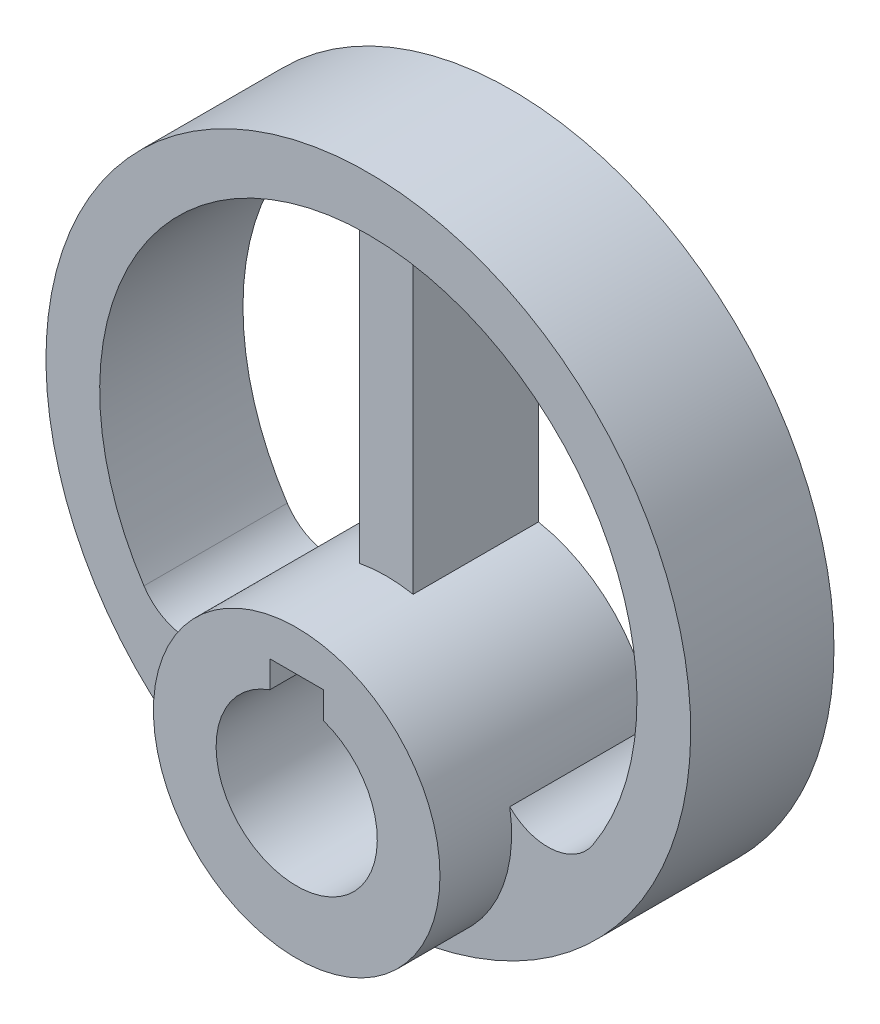
ISO-10303-21;
HEADER;
FILE_DESCRIPTION(('STEP AP214'),'2;1');
FILE_NAME('part.step','',(''),(''),'','','');
FILE_SCHEMA(('AUTOMOTIVE_DESIGN { 1 0 10303 214 1 1 1 1 }'));
ENDSEC;
DATA;
#1=APPLICATION_CONTEXT('core data for automotive mechanical design processes');
#2=APPLICATION_PROTOCOL_DEFINITION('international standard','automotive_design',2000,#1);
#3=PRODUCT_CONTEXT('',#1,'mechanical');
#4=PRODUCT('Part','Part','',(#3));
#5=PRODUCT_RELATED_PRODUCT_CATEGORY('part','',(#4));
#6=PRODUCT_DEFINITION_FORMATION('','',#4);
#7=PRODUCT_DEFINITION_CONTEXT('part definition',#1,'design');
#8=PRODUCT_DEFINITION('design','',#6,#7);
#9=PRODUCT_DEFINITION_SHAPE('','',#8);
#10=(LENGTH_UNIT() NAMED_UNIT(*) SI_UNIT(.MILLI.,.METRE.));
#11=(NAMED_UNIT(*) PLANE_ANGLE_UNIT() SI_UNIT($,.RADIAN.));
#12=(NAMED_UNIT(*) SI_UNIT($,.STERADIAN.) SOLID_ANGLE_UNIT());
#13=UNCERTAINTY_MEASURE_WITH_UNIT(LENGTH_MEASURE(1.E-05),#10,'distance_accuracy_value','');
#14=(GEOMETRIC_REPRESENTATION_CONTEXT(3) GLOBAL_UNCERTAINTY_ASSIGNED_CONTEXT((#13)) GLOBAL_UNIT_ASSIGNED_CONTEXT((#10,
#11,#12)) REPRESENTATION_CONTEXT('',''));
#15=CARTESIAN_POINT('',(0.,0.,0.));
#16=DIRECTION('',(0.,0.,1.));
#17=DIRECTION('',(1.,0.,0.));
#18=AXIS2_PLACEMENT_3D('',#15,#16,#17);
#19=CARTESIAN_POINT('',(0.,0.,25.4));
#20=DIRECTION('',(0.,0.,-1.));
#21=DIRECTION('',(-1.,0.,0.));
#22=AXIS2_PLACEMENT_3D('',#19,#20,#21);
#23=CYLINDRICAL_SURFACE('',#22,47.625);
#24=CARTESIAN_POINT('',(0.,0.,0.));
#25=DIRECTION('',(0.,0.,1.));
#26=DIRECTION('',(1.,0.,0.));
#27=AXIS2_PLACEMENT_3D('',#24,#25,#26);
#28=CIRCLE('',#27,47.625);
#29=CARTESIAN_POINT('',(-4.7625,47.3862766922028,0.));
#30=VERTEX_POINT('',#29);
#31=CARTESIAN_POINT('',(-39.7790804501483,-26.1871224753815,0.));
#32=VERTEX_POINT('',#31);
#33=EDGE_CURVE('E155',#30,#32,#28,.T.);
#34=ORIENTED_EDGE('',*,*,#33,.F.);
#35=DIRECTION('',(0.,0.,-1.));
#36=VECTOR('',#35,1.);
#37=CARTESIAN_POINT('',(-4.7625,47.3862766922028,25.4));
#38=LINE('',#37,#36);
#39=CARTESIAN_POINT('',(-4.7625,47.3862766922028,22.225));
#40=VERTEX_POINT('',#39);
#41=EDGE_CURVE('E232',#30,#40,#38,.F.);
#42=ORIENTED_EDGE('',*,*,#41,.T.);
#43=CARTESIAN_POINT('',(0.,0.,22.225));
#44=DIRECTION('',(0.,0.,-1.));
#45=DIRECTION('',(-1.,0.,0.));
#46=AXIS2_PLACEMENT_3D('',#43,#44,#45);
#47=CIRCLE('',#46,47.625);
#48=CARTESIAN_POINT('',(4.7625,47.3862766922028,22.225));
#49=VERTEX_POINT('',#48);
#50=EDGE_CURVE('E148',#40,#49,#47,.T.);
#51=ORIENTED_EDGE('',*,*,#50,.T.);
#52=DIRECTION('',(0.,0.,-1.));
#53=VECTOR('',#52,1.);
#54=CARTESIAN_POINT('',(4.7625,47.3862766922028,25.4));
#55=LINE('',#54,#53);
#56=CARTESIAN_POINT('',(4.7625,47.3862766922028,0.));
#57=VERTEX_POINT('',#56);
#58=EDGE_CURVE('E133',#49,#57,#55,.T.);
#59=ORIENTED_EDGE('',*,*,#58,.T.);
#60=CARTESIAN_POINT('',(39.7790804501483,-26.1871224753815,0.));
#61=VERTEX_POINT('',#60);
#62=EDGE_CURVE('E145',#61,#57,#28,.T.);
#63=ORIENTED_EDGE('',*,*,#62,.F.);
#64=DIRECTION('',(0.,0.,-1.));
#65=VECTOR('',#64,1.);
#66=CARTESIAN_POINT('',(39.7790804501483,-26.1871224753815,25.4));
#67=LINE('',#66,#65);
#68=CARTESIAN_POINT('',(39.7790804501483,-26.1871224753815,25.4));
#69=VERTEX_POINT('',#68);
#70=EDGE_CURVE('E188',#69,#61,#67,.T.);
#71=ORIENTED_EDGE('',*,*,#70,.F.);
#72=CARTESIAN_POINT('',(0.,0.,25.4));
#73=DIRECTION('',(0.,0.,1.));
#74=DIRECTION('',(1.,0.,0.));
#75=AXIS2_PLACEMENT_3D('',#72,#73,#74);
#76=CIRCLE('',#75,47.625);
#77=CARTESIAN_POINT('',(-39.7790804501483,-26.1871224753815,25.4));
#78=VERTEX_POINT('',#77);
#79=EDGE_CURVE('E184',#69,#78,#76,.T.);
#80=ORIENTED_EDGE('',*,*,#79,.T.);
#81=DIRECTION('',(0.,0.,-1.));
#82=VECTOR('',#81,1.);
#83=CARTESIAN_POINT('',(-39.7790804501483,-26.1871224753815,25.4));
#84=LINE('',#83,#82);
#85=EDGE_CURVE('E196',#78,#32,#84,.T.);
#86=ORIENTED_EDGE('',*,*,#85,.T.);
#87=EDGE_LOOP('',(#34,#42,#51,#59,#63,#71,#80,#86));
#88=FACE_BOUND('',#87,.T.);
#89=ADVANCED_FACE('F42',(#88),#23,.F.);
#90=CARTESIAN_POINT('',(0.,-31.75,25.4));
#91=DIRECTION('',(0.,0.,-1.));
#92=DIRECTION('',(-1.,0.,0.));
#93=AXIS2_PLACEMENT_3D('',#90,#91,#92);
#94=CYLINDRICAL_SURFACE('',#93,25.4);
#95=CARTESIAN_POINT('',(0.,-31.75,38.1));
#96=DIRECTION('',(0.,0.,1.));
#97=DIRECTION('',(1.,0.,0.));
#98=AXIS2_PLACEMENT_3D('',#95,#96,#97);
#99=CIRCLE('',#98,25.4);
#100=CARTESIAN_POINT('',(25.4,-31.75,38.1));
#101=VERTEX_POINT('',#100);
#102=EDGE_CURVE('E159',#101,#101,#99,.T.);
#103=ORIENTED_EDGE('',*,*,#102,.F.);
#104=EDGE_LOOP('',(#103));
#105=FACE_BOUND('',#104,.T.);
#106=DIRECTION('',(0.,0.,-1.));
#107=VECTOR('',#106,1.);
#108=CARTESIAN_POINT('',(-4.7625,-6.80047908776604,25.4));
#109=LINE('',#108,#107);
#110=CARTESIAN_POINT('',(-4.7625,-6.80047908776604,0.));
#111=VERTEX_POINT('',#110);
#112=CARTESIAN_POINT('',(-4.7625,-6.80047908776604,22.225));
#113=VERTEX_POINT('',#112);
#114=EDGE_CURVE('E149',#111,#113,#109,.F.);
#115=ORIENTED_EDGE('',*,*,#114,.F.);
#116=CARTESIAN_POINT('',(0.,-31.75,0.));
#117=DIRECTION('',(0.,0.,1.));
#118=DIRECTION('',(1.,0.,0.));
#119=AXIS2_PLACEMENT_3D('',#116,#117,#118);
#120=CIRCLE('',#119,25.4);
#121=CARTESIAN_POINT('',(-25.0695784709871,-27.6663453516465,0.));
#122=VERTEX_POINT('',#121);
#123=EDGE_CURVE('E157',#111,#122,#120,.T.);
#124=ORIENTED_EDGE('',*,*,#123,.T.);
#125=DIRECTION('',(0.,0.,-1.));
#126=VECTOR('',#125,1.);
#127=CARTESIAN_POINT('',(-25.0695784709871,-27.6663453516465,25.4));
#128=LINE('',#127,#126);
#129=CARTESIAN_POINT('',(-25.0695784709871,-27.6663453516465,25.4));
#130=VERTEX_POINT('',#129);
#131=EDGE_CURVE('E199',#130,#122,#128,.T.);
#132=ORIENTED_EDGE('',*,*,#131,.F.);
#133=CARTESIAN_POINT('',(0.,-31.75,25.4));
#134=DIRECTION('',(0.,0.,1.));
#135=DIRECTION('',(1.,0.,0.));
#136=AXIS2_PLACEMENT_3D('',#133,#134,#135);
#137=CIRCLE('',#136,25.4);
#138=CARTESIAN_POINT('',(0.,-57.15,25.4));
#139=VERTEX_POINT('',#138);
#140=EDGE_CURVE('E49',#130,#139,#137,.T.);
#141=ORIENTED_EDGE('',*,*,#140,.T.);
#142=CARTESIAN_POINT('',(25.0695784709871,-27.6663453516465,25.4));
#143=VERTEX_POINT('',#142);
#144=EDGE_CURVE('E195',#139,#143,#137,.T.);
#145=ORIENTED_EDGE('',*,*,#144,.T.);
#146=DIRECTION('',(0.,0.,-1.));
#147=VECTOR('',#146,1.);
#148=CARTESIAN_POINT('',(25.0695784709871,-27.6663453516465,25.4));
#149=LINE('',#148,#147);
#150=CARTESIAN_POINT('',(25.0695784709871,-27.6663453516465,0.));
#151=VERTEX_POINT('',#150);
#152=EDGE_CURVE('E202',#143,#151,#149,.T.);
#153=ORIENTED_EDGE('',*,*,#152,.T.);
#154=CARTESIAN_POINT('',(4.7625,-6.80047908776603,0.));
#155=VERTEX_POINT('',#154);
#156=EDGE_CURVE('E164',#151,#155,#120,.T.);
#157=ORIENTED_EDGE('',*,*,#156,.T.);
#158=DIRECTION('',(0.,0.,-1.));
#159=VECTOR('',#158,1.);
#160=CARTESIAN_POINT('',(4.7625,-6.80047908776603,25.4));
#161=LINE('',#160,#159);
#162=CARTESIAN_POINT('',(4.7625,-6.80047908776604,22.225));
#163=VERTEX_POINT('',#162);
#164=EDGE_CURVE('E56',#163,#155,#161,.T.);
#165=ORIENTED_EDGE('',*,*,#164,.F.);
#166=CARTESIAN_POINT('',(0.,-31.75,22.225));
#167=DIRECTION('',(0.,0.,-1.));
#168=DIRECTION('',(-1.,0.,0.));
#169=AXIS2_PLACEMENT_3D('',#166,#167,#168);
#170=CIRCLE('',#169,25.4);
#171=EDGE_CURVE('E11',#113,#163,#170,.T.);
#172=ORIENTED_EDGE('',*,*,#171,.F.);
#173=EDGE_LOOP('',(#115,#124,#132,#141,#145,#153,#157,#165,#172));
#174=FACE_BOUND('',#173,.T.);
#175=ADVANCED_FACE('F227',(#105,#174),#94,.T.);
#176=CARTESIAN_POINT('',(0.,-31.75,25.4));
#177=DIRECTION('',(0.,0.,-1.));
#178=DIRECTION('',(-1.,0.,0.));
#179=AXIS2_PLACEMENT_3D('',#176,#177,#178);
#180=CYLINDRICAL_SURFACE('',#179,14.2875);
#181=CARTESIAN_POINT('',(0.,-31.75,0.));
#182=DIRECTION('',(0.,0.,1.));
#183=DIRECTION('',(1.,0.,0.));
#184=AXIS2_PLACEMENT_3D('',#181,#182,#183);
#185=CIRCLE('',#184,14.2875);
#186=CARTESIAN_POINT('',(-4.7625,-18.2796158183963,0.));
#187=VERTEX_POINT('',#186);
#188=CARTESIAN_POINT('',(4.7625,-18.2796158183963,0.));
#189=VERTEX_POINT('',#188);
#190=EDGE_CURVE('E169',#187,#189,#185,.T.);
#191=ORIENTED_EDGE('',*,*,#190,.F.);
#192=DIRECTION('',(0.,0.,-1.));
#193=VECTOR('',#192,1.);
#194=CARTESIAN_POINT('',(-4.7625,-18.2796158183963,25.4));
#195=LINE('',#194,#193);
#196=CARTESIAN_POINT('',(-4.7625,-18.2796158183963,38.1));
#197=VERTEX_POINT('',#196);
#198=EDGE_CURVE('E193',#197,#187,#195,.T.);
#199=ORIENTED_EDGE('',*,*,#198,.F.);
#200=CARTESIAN_POINT('',(0.,-31.75,38.1));
#201=DIRECTION('',(0.,0.,1.));
#202=DIRECTION('',(1.,0.,0.));
#203=AXIS2_PLACEMENT_3D('',#200,#201,#202);
#204=CIRCLE('',#203,14.2875);
#205=CARTESIAN_POINT('',(4.7625,-18.2796158183963,38.1));
#206=VERTEX_POINT('',#205);
#207=EDGE_CURVE('E241',#197,#206,#204,.T.);
#208=ORIENTED_EDGE('',*,*,#207,.T.);
#209=DIRECTION('',(0.,0.,-1.));
#210=VECTOR('',#209,1.);
#211=CARTESIAN_POINT('',(4.7625,-18.2796158183963,25.4));
#212=LINE('',#211,#210);
#213=EDGE_CURVE('E185',#206,#189,#212,.T.);
#214=ORIENTED_EDGE('',*,*,#213,.T.);
#215=EDGE_LOOP('',(#191,#199,#208,#214));
#216=FACE_BOUND('',#215,.T.);
#217=ADVANCED_FACE('F262',(#216),#180,.F.);
#218=CARTESIAN_POINT('',(-4.7625,0.,25.4));
#219=DIRECTION('',(1.,0.,0.));
#220=DIRECTION('',(0.,1.,0.));
#221=AXIS2_PLACEMENT_3D('',#218,#219,#220);
#222=PLANE('',#221);
#223=DIRECTION('',(0.,-1.,0.));
#224=VECTOR('',#223,1.);
#225=CARTESIAN_POINT('',(-4.7625,0.,0.));
#226=LINE('',#225,#224);
#227=CARTESIAN_POINT('',(-4.7625,-13.5171158183963,0.));
#228=VERTEX_POINT('',#227);
#229=EDGE_CURVE('E172',#228,#187,#226,.T.);
#230=ORIENTED_EDGE('',*,*,#229,.F.);
#231=DIRECTION('',(0.,0.,-1.));
#232=VECTOR('',#231,1.);
#233=CARTESIAN_POINT('',(-4.7625,-13.5171158183963,25.4));
#234=LINE('',#233,#232);
#235=CARTESIAN_POINT('',(-4.7625,-13.5171158183963,38.1));
#236=VERTEX_POINT('',#235);
#237=EDGE_CURVE('E191',#236,#228,#234,.T.);
#238=ORIENTED_EDGE('',*,*,#237,.F.);
#239=DIRECTION('',(0.,-1.,0.));
#240=VECTOR('',#239,1.);
#241=CARTESIAN_POINT('',(-4.7625,-18.2796158183963,38.1));
#242=LINE('',#241,#240);
#243=EDGE_CURVE('E253',#236,#197,#242,.T.);
#244=ORIENTED_EDGE('',*,*,#243,.T.);
#245=ORIENTED_EDGE('',*,*,#198,.T.);
#246=EDGE_LOOP('',(#230,#238,#244,#245));
#247=FACE_BOUND('',#246,.T.);
#248=ADVANCED_FACE('F268',(#247),#222,.T.);
#249=CARTESIAN_POINT('',(0.,-13.5171158183963,25.4));
#250=DIRECTION('',(0.,1.,0.));
#251=DIRECTION('',(0.,0.,1.));
#252=AXIS2_PLACEMENT_3D('',#249,#250,#251);
#253=PLANE('',#252);
#254=DIRECTION('',(1.,0.,0.));
#255=VECTOR('',#254,1.);
#256=CARTESIAN_POINT('',(0.,-13.5171158183963,0.));
#257=LINE('',#256,#255);
#258=CARTESIAN_POINT('',(4.7625,-13.5171158183963,0.));
#259=VERTEX_POINT('',#258);
#260=EDGE_CURVE('E175',#228,#259,#257,.T.);
#261=ORIENTED_EDGE('',*,*,#260,.T.);
#262=DIRECTION('',(0.,0.,-1.));
#263=VECTOR('',#262,1.);
#264=CARTESIAN_POINT('',(4.7625,-13.5171158183963,25.4));
#265=LINE('',#264,#263);
#266=CARTESIAN_POINT('',(4.7625,-13.5171158183963,38.1));
#267=VERTEX_POINT('',#266);
#268=EDGE_CURVE('E187',#267,#259,#265,.T.);
#269=ORIENTED_EDGE('',*,*,#268,.F.);
#270=DIRECTION('',(-1.,0.,0.));
#271=VECTOR('',#270,1.);
#272=CARTESIAN_POINT('',(-4.7625,-13.5171158183963,38.1));
#273=LINE('',#272,#271);
#274=EDGE_CURVE('E250',#267,#236,#273,.T.);
#275=ORIENTED_EDGE('',*,*,#274,.T.);
#276=ORIENTED_EDGE('',*,*,#237,.T.);
#277=EDGE_LOOP('',(#261,#269,#275,#276));
#278=FACE_BOUND('',#277,.T.);
#279=ADVANCED_FACE('F274',(#278),#253,.F.);
#280=CARTESIAN_POINT('',(31.8232643601186,-20.9496979803052,25.4));
#281=DIRECTION('',(0.,0.,-1.));
#282=DIRECTION('',(-1.,0.,0.));
#283=AXIS2_PLACEMENT_3D('',#280,#281,#282);
#284=CYLINDRICAL_SURFACE('',#283,9.525);
#285=CARTESIAN_POINT('',(31.8232643601186,-20.9496979803052,0.));
#286=DIRECTION('',(0.,0.,1.));
#287=DIRECTION('',(1.,0.,0.));
#288=AXIS2_PLACEMENT_3D('',#285,#286,#287);
#289=CIRCLE('',#288,9.525);
#290=EDGE_CURVE('E154',#151,#61,#289,.T.);
#291=ORIENTED_EDGE('',*,*,#290,.F.);
#292=ORIENTED_EDGE('',*,*,#152,.F.);
#293=CARTESIAN_POINT('',(31.8232643601186,-20.9496979803052,25.4));
#294=DIRECTION('',(0.,0.,1.));
#295=DIRECTION('',(1.,0.,0.));
#296=AXIS2_PLACEMENT_3D('',#293,#294,#295);
#297=CIRCLE('',#296,9.525);
#298=EDGE_CURVE('E207',#143,#69,#297,.T.);
#299=ORIENTED_EDGE('',*,*,#298,.T.);
#300=ORIENTED_EDGE('',*,*,#70,.T.);
#301=EDGE_LOOP('',(#291,#292,#299,#300));
#302=FACE_BOUND('',#301,.T.);
#303=ADVANCED_FACE('F205',(#302),#284,.F.);
#304=CARTESIAN_POINT('',(4.7625,0.,25.4));
#305=DIRECTION('',(1.,0.,0.));
#306=DIRECTION('',(0.,0.,-1.));
#307=AXIS2_PLACEMENT_3D('',#304,#305,#306);
#308=PLANE('',#307);
#309=DIRECTION('',(0.,-1.,0.));
#310=VECTOR('',#309,1.);
#311=CARTESIAN_POINT('',(4.7625,0.,0.));
#312=LINE('',#311,#310);
#313=EDGE_CURVE('E178',#259,#189,#312,.T.);
#314=ORIENTED_EDGE('',*,*,#313,.T.);
#315=ORIENTED_EDGE('',*,*,#213,.F.);
#316=DIRECTION('',(0.,1.,0.));
#317=VECTOR('',#316,1.);
#318=CARTESIAN_POINT('',(4.7625,-13.5171158183963,38.1));
#319=LINE('',#318,#317);
#320=EDGE_CURVE('E247',#206,#267,#319,.T.);
#321=ORIENTED_EDGE('',*,*,#320,.T.);
#322=ORIENTED_EDGE('',*,*,#268,.T.);
#323=EDGE_LOOP('',(#314,#315,#321,#322));
#324=FACE_BOUND('',#323,.T.);
#325=ADVANCED_FACE('F273',(#324),#308,.F.);
#326=CARTESIAN_POINT('',(-31.8232643601186,-20.9496979803052,25.4));
#327=DIRECTION('',(0.,0.,-1.));
#328=DIRECTION('',(-1.,0.,0.));
#329=AXIS2_PLACEMENT_3D('',#326,#327,#328);
#330=CYLINDRICAL_SURFACE('',#329,9.525);
#331=CARTESIAN_POINT('',(-31.8232643601186,-20.9496979803052,0.));
#332=DIRECTION('',(0.,0.,1.));
#333=DIRECTION('',(1.,0.,0.));
#334=AXIS2_PLACEMENT_3D('',#331,#332,#333);
#335=CIRCLE('',#334,9.525);
#336=EDGE_CURVE('E166',#122,#32,#335,.F.);
#337=ORIENTED_EDGE('',*,*,#336,.T.);
#338=ORIENTED_EDGE('',*,*,#85,.F.);
#339=CARTESIAN_POINT('',(-31.8232643601186,-20.9496979803052,25.4));
#340=DIRECTION('',(0.,0.,1.));
#341=DIRECTION('',(1.,0.,0.));
#342=AXIS2_PLACEMENT_3D('',#339,#340,#341);
#343=CIRCLE('',#342,9.525);
#344=EDGE_CURVE('E213',#130,#78,#343,.F.);
#345=ORIENTED_EDGE('',*,*,#344,.F.);
#346=ORIENTED_EDGE('',*,*,#131,.T.);
#347=EDGE_LOOP('',(#337,#338,#345,#346));
#348=FACE_BOUND('',#347,.T.);
#349=ADVANCED_FACE('F230',(#348),#330,.F.);
#350=CARTESIAN_POINT('',(0.,0.,25.4));
#351=DIRECTION('',(0.,0.,-1.));
#352=DIRECTION('',(-1.,0.,0.));
#353=AXIS2_PLACEMENT_3D('',#350,#351,#352);
#354=CYLINDRICAL_SURFACE('',#353,57.15);
#355=CARTESIAN_POINT('',(0.,0.,25.4));
#356=DIRECTION('',(0.,0.,1.));
#357=DIRECTION('',(1.,0.,0.));
#358=AXIS2_PLACEMENT_3D('',#355,#356,#357);
#359=CIRCLE('',#358,57.15);
#360=EDGE_CURVE('E161',#139,#139,#359,.T.);
#361=ORIENTED_EDGE('',*,*,#360,.F.);
#362=EDGE_LOOP('',(#361));
#363=FACE_BOUND('',#362,.T.);
#364=CARTESIAN_POINT('',(0.,0.,0.));
#365=DIRECTION('',(0.,0.,1.));
#366=DIRECTION('',(1.,0.,0.));
#367=AXIS2_PLACEMENT_3D('',#364,#365,#366);
#368=CIRCLE('',#367,57.15);
#369=CARTESIAN_POINT('',(57.15,0.,0.));
#370=VERTEX_POINT('',#369);
#371=EDGE_CURVE('E181',#370,#370,#368,.T.);
#372=ORIENTED_EDGE('',*,*,#371,.T.);
#373=EDGE_LOOP('',(#372));
#374=FACE_BOUND('',#373,.T.);
#375=ADVANCED_FACE('F225',(#363,#374),#354,.T.);
#376=CARTESIAN_POINT('',(0.,0.,25.4));
#377=DIRECTION('',(0.,0.,1.));
#378=DIRECTION('',(1.,0.,0.));
#379=AXIS2_PLACEMENT_3D('',#376,#377,#378);
#380=PLANE('',#379);
#381=ORIENTED_EDGE('',*,*,#140,.F.);
#382=ORIENTED_EDGE('',*,*,#344,.T.);
#383=ORIENTED_EDGE('',*,*,#79,.F.);
#384=ORIENTED_EDGE('',*,*,#298,.F.);
#385=ORIENTED_EDGE('',*,*,#144,.F.);
#386=ORIENTED_EDGE('',*,*,#360,.T.);
#387=EDGE_LOOP('',(#381,#382,#383,#384,#385,#386));
#388=FACE_BOUND('',#387,.T.);
#389=ADVANCED_FACE('F211',(#388),#380,.T.);
#390=CARTESIAN_POINT('',(0.,0.,0.));
#391=DIRECTION('',(0.,0.,1.));
#392=DIRECTION('',(1.,0.,0.));
#393=AXIS2_PLACEMENT_3D('',#390,#391,#392);
#394=PLANE('',#393);
#395=DIRECTION('',(0.,-1.,0.));
#396=VECTOR('',#395,1.);
#397=CARTESIAN_POINT('',(-4.7625,-7.67136315049299,0.));
#398=LINE('',#397,#396);
#399=EDGE_CURVE('E139',#30,#111,#398,.T.);
#400=ORIENTED_EDGE('',*,*,#399,.F.);
#401=ORIENTED_EDGE('',*,*,#33,.T.);
#402=ORIENTED_EDGE('',*,*,#336,.F.);
#403=ORIENTED_EDGE('',*,*,#123,.F.);
#404=EDGE_LOOP('',(#400,#401,#402,#403));
#405=FACE_BOUND('',#404,.T.);
#406=ORIENTED_EDGE('',*,*,#62,.T.);
#407=DIRECTION('',(0.,1.,0.));
#408=VECTOR('',#407,1.);
#409=CARTESIAN_POINT('',(4.7625,-7.67136315049299,0.));
#410=LINE('',#409,#408);
#411=EDGE_CURVE('E129',#155,#57,#410,.T.);
#412=ORIENTED_EDGE('',*,*,#411,.F.);
#413=ORIENTED_EDGE('',*,*,#156,.F.);
#414=ORIENTED_EDGE('',*,*,#290,.T.);
#415=EDGE_LOOP('',(#406,#412,#413,#414));
#416=FACE_BOUND('',#415,.T.);
#417=ORIENTED_EDGE('',*,*,#190,.T.);
#418=ORIENTED_EDGE('',*,*,#313,.F.);
#419=ORIENTED_EDGE('',*,*,#260,.F.);
#420=ORIENTED_EDGE('',*,*,#229,.T.);
#421=EDGE_LOOP('',(#417,#418,#419,#420));
#422=FACE_BOUND('',#421,.T.);
#423=ORIENTED_EDGE('',*,*,#371,.F.);
#424=EDGE_LOOP('',(#423));
#425=FACE_BOUND('',#424,.T.);
#426=ADVANCED_FACE('F151',(#405,#416,#422,#425),#394,.F.);
#427=CARTESIAN_POINT('',(0.,-31.75,38.1));
#428=DIRECTION('',(0.,0.,1.));
#429=DIRECTION('',(1.,0.,0.));
#430=AXIS2_PLACEMENT_3D('',#427,#428,#429);
#431=PLANE('',#430);
#432=ORIENTED_EDGE('',*,*,#102,.T.);
#433=EDGE_LOOP('',(#432));
#434=FACE_BOUND('',#433,.T.);
#435=ORIENTED_EDGE('',*,*,#320,.F.);
#436=ORIENTED_EDGE('',*,*,#207,.F.);
#437=ORIENTED_EDGE('',*,*,#243,.F.);
#438=ORIENTED_EDGE('',*,*,#274,.F.);
#439=EDGE_LOOP('',(#435,#436,#437,#438));
#440=FACE_BOUND('',#439,.T.);
#441=ADVANCED_FACE('F258',(#434,#440),#431,.T.);
#442=CARTESIAN_POINT('',(0.,0.,22.225));
#443=DIRECTION('',(0.,0.,-1.));
#444=DIRECTION('',(-1.,0.,0.));
#445=AXIS2_PLACEMENT_3D('',#442,#443,#444);
#446=PLANE('',#445);
#447=ORIENTED_EDGE('',*,*,#50,.F.);
#448=DIRECTION('',(0.,-1.,0.));
#449=VECTOR('',#448,1.);
#450=CARTESIAN_POINT('',(-4.7625,-7.67136315049299,22.225));
#451=LINE('',#450,#449);
#452=EDGE_CURVE('E138',#40,#113,#451,.T.);
#453=ORIENTED_EDGE('',*,*,#452,.T.);
#454=ORIENTED_EDGE('',*,*,#171,.T.);
#455=DIRECTION('',(0.,1.,0.));
#456=VECTOR('',#455,1.);
#457=CARTESIAN_POINT('',(4.7625,-7.67136315049299,22.225));
#458=LINE('',#457,#456);
#459=EDGE_CURVE('E306',#163,#49,#458,.T.);
#460=ORIENTED_EDGE('',*,*,#459,.T.);
#461=EDGE_LOOP('',(#447,#453,#454,#460));
#462=FACE_BOUND('',#461,.T.);
#463=ADVANCED_FACE('F297',(#462),#446,.F.);
#464=CARTESIAN_POINT('',(-4.7625,-7.67136315049299,22.225));
#465=DIRECTION('',(1.,0.,0.));
#466=DIRECTION('',(0.,0.,-1.));
#467=AXIS2_PLACEMENT_3D('',#464,#465,#466);
#468=PLANE('',#467);
#469=ORIENTED_EDGE('',*,*,#41,.F.);
#470=ORIENTED_EDGE('',*,*,#399,.T.);
#471=ORIENTED_EDGE('',*,*,#114,.T.);
#472=ORIENTED_EDGE('',*,*,#452,.F.);
#473=EDGE_LOOP('',(#469,#470,#471,#472));
#474=FACE_BOUND('',#473,.T.);
#475=ADVANCED_FACE('F238',(#474),#468,.F.);
#476=CARTESIAN_POINT('',(4.7625,-7.67136315049299,22.225));
#477=DIRECTION('',(-1.,0.,0.));
#478=DIRECTION('',(0.,0.,1.));
#479=AXIS2_PLACEMENT_3D('',#476,#477,#478);
#480=PLANE('',#479);
#481=ORIENTED_EDGE('',*,*,#58,.F.);
#482=ORIENTED_EDGE('',*,*,#459,.F.);
#483=ORIENTED_EDGE('',*,*,#164,.T.);
#484=ORIENTED_EDGE('',*,*,#411,.T.);
#485=EDGE_LOOP('',(#481,#482,#483,#484));
#486=FACE_BOUND('',#485,.T.);
#487=ADVANCED_FACE('F131',(#486),#480,.F.);
#488=CLOSED_SHELL('',(#89,#175,#217,#248,#279,#303,#325,#349,#375,#389,#426,#441,#463,#475,#487));
#489=MANIFOLD_SOLID_BREP('B2',#488);
#490=ADVANCED_BREP_SHAPE_REPRESENTATION('',(#18,#489),#14);
#491=SHAPE_DEFINITION_REPRESENTATION(#9,#490);
ENDSEC;
END-ISO-10303-21;
